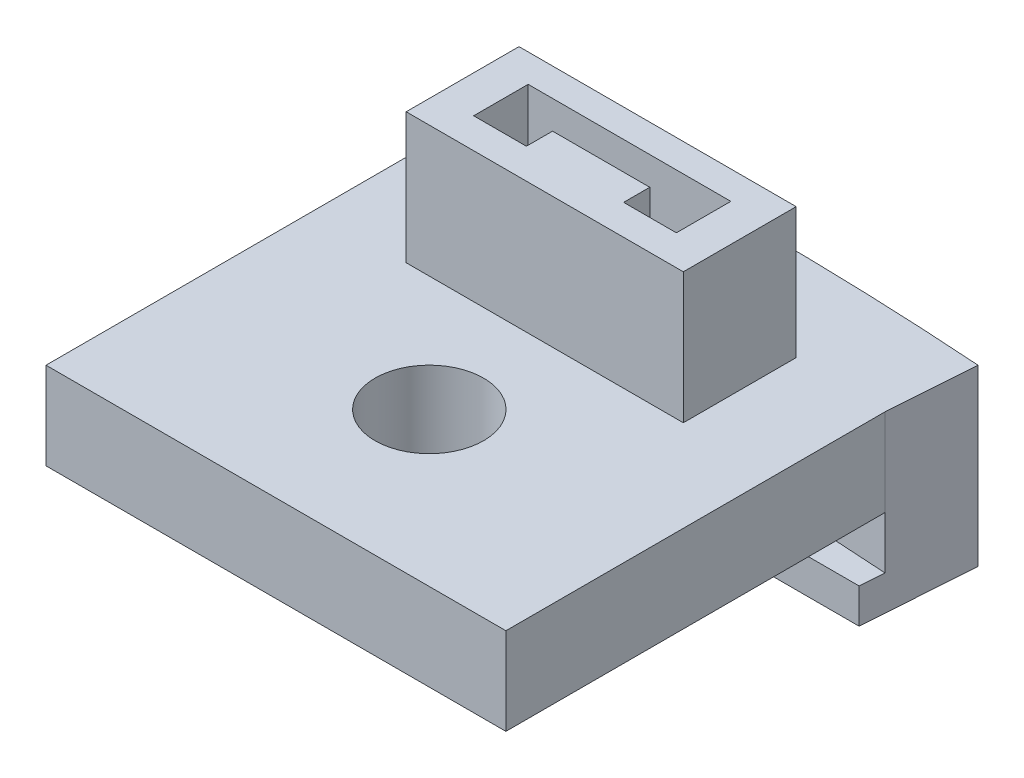
ISO-10303-21;
HEADER;
FILE_DESCRIPTION(('STEP AP214'),'2;1');
FILE_NAME('part.step','',(''),(''),'','','');
FILE_SCHEMA(('AUTOMOTIVE_DESIGN { 1 0 10303 214 1 1 1 1 }'));
ENDSEC;
DATA;
#1=APPLICATION_CONTEXT('core data for automotive mechanical design processes');
#2=APPLICATION_PROTOCOL_DEFINITION('international standard','automotive_design',2000,#1);
#3=PRODUCT_CONTEXT('',#1,'mechanical');
#4=PRODUCT('Part','Part','',(#3));
#5=PRODUCT_RELATED_PRODUCT_CATEGORY('part','',(#4));
#6=PRODUCT_DEFINITION_FORMATION('','',#4);
#7=PRODUCT_DEFINITION_CONTEXT('part definition',#1,'design');
#8=PRODUCT_DEFINITION('design','',#6,#7);
#9=PRODUCT_DEFINITION_SHAPE('','',#8);
#10=(LENGTH_UNIT() NAMED_UNIT(*) SI_UNIT(.MILLI.,.METRE.));
#11=(NAMED_UNIT(*) PLANE_ANGLE_UNIT() SI_UNIT($,.RADIAN.));
#12=(NAMED_UNIT(*) SI_UNIT($,.STERADIAN.) SOLID_ANGLE_UNIT());
#13=UNCERTAINTY_MEASURE_WITH_UNIT(LENGTH_MEASURE(1.E-05),#10,'distance_accuracy_value','');
#14=(GEOMETRIC_REPRESENTATION_CONTEXT(3) GLOBAL_UNCERTAINTY_ASSIGNED_CONTEXT((#13)) GLOBAL_UNIT_ASSIGNED_CONTEXT((#10,
#11,#12)) REPRESENTATION_CONTEXT('',''));
#15=CARTESIAN_POINT('',(0.,0.,0.));
#16=DIRECTION('',(0.,0.,1.));
#17=DIRECTION('',(1.,0.,0.));
#18=AXIS2_PLACEMENT_3D('',#15,#16,#17);
#19=CARTESIAN_POINT('',(0.,0.,0.));
#20=DIRECTION('',(0.,1.,0.));
#21=DIRECTION('',(0.,0.,1.));
#22=AXIS2_PLACEMENT_3D('',#19,#20,#21);
#23=PLANE('',#22);
#24=CARTESIAN_POINT('',(0.,0.,13.62075));
#25=DIRECTION('',(0.,1.,0.));
#26=DIRECTION('',(0.,0.,1.));
#27=AXIS2_PLACEMENT_3D('',#24,#25,#26);
#28=CIRCLE('',#27,5.53085);
#29=CARTESIAN_POINT('',(0.,0.,19.1516));
#30=VERTEX_POINT('',#29);
#31=EDGE_CURVE('E715',#30,#30,#28,.T.);
#32=ORIENTED_EDGE('',*,*,#31,.T.);
#33=EDGE_LOOP('',(#32));
#34=FACE_BOUND('',#33,.T.);
#35=DIRECTION('',(1.,0.,0.));
#36=VECTOR('',#35,1.);
#37=CARTESIAN_POINT('',(0.,0.,1.9558));
#38=LINE('',#37,#36);
#39=CARTESIAN_POINT('',(-5.9055,0.,1.9558));
#40=VERTEX_POINT('',#39);
#41=CARTESIAN_POINT('',(5.9055,0.,1.9558));
#42=VERTEX_POINT('',#41);
#43=EDGE_CURVE('E155',#40,#42,#38,.T.);
#44=ORIENTED_EDGE('',*,*,#43,.F.);
#45=DIRECTION('',(0.,0.,1.));
#46=VECTOR('',#45,1.);
#47=CARTESIAN_POINT('',(-5.9055,0.,0.));
#48=LINE('',#47,#46);
#49=CARTESIAN_POINT('',(-5.9055,0.,5.1308));
#50=VERTEX_POINT('',#49);
#51=EDGE_CURVE('E164',#40,#50,#48,.T.);
#52=ORIENTED_EDGE('',*,*,#51,.T.);
#53=DIRECTION('',(1.,0.,0.));
#54=VECTOR('',#53,1.);
#55=CARTESIAN_POINT('',(0.,0.,5.1308));
#56=LINE('',#55,#54);
#57=CARTESIAN_POINT('',(-2.8321,0.,5.1308));
#58=VERTEX_POINT('',#57);
#59=EDGE_CURVE('E161',#50,#58,#56,.T.);
#60=ORIENTED_EDGE('',*,*,#59,.T.);
#61=DIRECTION('',(0.,0.,1.));
#62=VECTOR('',#61,1.);
#63=CARTESIAN_POINT('',(-2.8321,0.,0.));
#64=LINE('',#63,#62);
#65=CARTESIAN_POINT('',(-2.8321,0.,3.6068));
#66=VERTEX_POINT('',#65);
#67=EDGE_CURVE('E214',#66,#58,#64,.T.);
#68=ORIENTED_EDGE('',*,*,#67,.F.);
#69=DIRECTION('',(1.,0.,0.));
#70=VECTOR('',#69,1.);
#71=CARTESIAN_POINT('',(0.,0.,3.6068));
#72=LINE('',#71,#70);
#73=CARTESIAN_POINT('',(2.8321,0.,3.6068));
#74=VERTEX_POINT('',#73);
#75=EDGE_CURVE('E248',#66,#74,#72,.T.);
#76=ORIENTED_EDGE('',*,*,#75,.T.);
#77=DIRECTION('',(0.,0.,1.));
#78=VECTOR('',#77,1.);
#79=CARTESIAN_POINT('',(2.8321,0.,0.));
#80=LINE('',#79,#78);
#81=CARTESIAN_POINT('',(2.8321,0.,5.1308));
#82=VERTEX_POINT('',#81);
#83=EDGE_CURVE('E208',#74,#82,#80,.T.);
#84=ORIENTED_EDGE('',*,*,#83,.T.);
#85=CARTESIAN_POINT('',(5.9055,0.,5.1308));
#86=VERTEX_POINT('',#85);
#87=EDGE_CURVE('E160',#82,#86,#56,.T.);
#88=ORIENTED_EDGE('',*,*,#87,.T.);
#89=DIRECTION('',(0.,0.,1.));
#90=VECTOR('',#89,1.);
#91=CARTESIAN_POINT('',(5.9055,0.,0.));
#92=LINE('',#91,#90);
#93=EDGE_CURVE('E157',#42,#86,#92,.T.);
#94=ORIENTED_EDGE('',*,*,#93,.F.);
#95=EDGE_LOOP('',(#44,#52,#60,#68,#76,#84,#88,#94));
#96=FACE_BOUND('',#95,.T.);
#97=CARTESIAN_POINT('',(0.,0.,192.0875));
#98=DIRECTION('',(0.,1.,0.));
#99=DIRECTION('',(0.,0.,1.));
#100=AXIS2_PLACEMENT_3D('',#97,#98,#99);
#101=CIRCLE('',#100,192.0875);
#102=CARTESIAN_POINT('',(13.3993466503233,0.,0.467915495715926));
#103=VERTEX_POINT('',#102);
#104=CARTESIAN_POINT('',(-13.3993466503233,0.,0.467915495715926));
#105=VERTEX_POINT('',#104);
#106=EDGE_CURVE('E192',#103,#105,#101,.T.);
#107=ORIENTED_EDGE('',*,*,#106,.F.);
#108=DIRECTION('',(0.,0.,1.));
#109=VECTOR('',#108,1.);
#110=CARTESIAN_POINT('',(13.3993466503233,0.,0.));
#111=LINE('',#110,#109);
#112=CARTESIAN_POINT('',(13.3993466503233,0.,22.5570249983964));
#113=VERTEX_POINT('',#112);
#114=EDGE_CURVE('E146',#103,#113,#111,.T.);
#115=ORIENTED_EDGE('',*,*,#114,.T.);
#116=DIRECTION('',(1.,0.,0.));
#117=VECTOR('',#116,1.);
#118=CARTESIAN_POINT('',(0.,0.,22.5570249983964));
#119=LINE('',#118,#117);
#120=CARTESIAN_POINT('',(-13.3993466503233,0.,22.5570249983964));
#121=VERTEX_POINT('',#120);
#122=EDGE_CURVE('E152',#121,#113,#119,.T.);
#123=ORIENTED_EDGE('',*,*,#122,.F.);
#124=DIRECTION('',(0.,0.,1.));
#125=VECTOR('',#124,1.);
#126=CARTESIAN_POINT('',(-13.3993466503233,0.,0.));
#127=LINE('',#126,#125);
#128=EDGE_CURVE('E149',#105,#121,#127,.T.);
#129=ORIENTED_EDGE('',*,*,#128,.F.);
#130=EDGE_LOOP('',(#107,#115,#123,#129));
#131=FACE_BOUND('',#130,.T.);
#132=ADVANCED_FACE('F34',(#34,#96,#131),#23,.F.);
#133=CARTESIAN_POINT('',(0.,5.08,5.1308));
#134=DIRECTION('',(0.,0.,-1.));
#135=DIRECTION('',(-1.,0.,0.));
#136=AXIS2_PLACEMENT_3D('',#133,#134,#135);
#137=PLANE('',#136);
#138=DIRECTION('',(0.,-1.,0.));
#139=VECTOR('',#138,1.);
#140=CARTESIAN_POINT('',(-5.9055,5.08,5.1308));
#141=LINE('',#140,#139);
#142=CARTESIAN_POINT('',(-5.9055,12.7,5.1308));
#143=VERTEX_POINT('',#142);
#144=EDGE_CURVE('E169',#143,#50,#141,.T.);
#145=ORIENTED_EDGE('',*,*,#144,.F.);
#146=DIRECTION('',(1.,0.,0.));
#147=VECTOR('',#146,1.);
#148=CARTESIAN_POINT('',(0.,12.7,5.1308));
#149=LINE('',#148,#147);
#150=CARTESIAN_POINT('',(-2.8321,12.7,5.1308));
#151=VERTEX_POINT('',#150);
#152=EDGE_CURVE('E233',#143,#151,#149,.T.);
#153=ORIENTED_EDGE('',*,*,#152,.T.);
#154=DIRECTION('',(0.,-1.,0.));
#155=VECTOR('',#154,1.);
#156=CARTESIAN_POINT('',(-2.8321,12.7,5.1308));
#157=LINE('',#156,#155);
#158=EDGE_CURVE('E253',#151,#58,#157,.T.);
#159=ORIENTED_EDGE('',*,*,#158,.T.);
#160=ORIENTED_EDGE('',*,*,#59,.F.);
#161=EDGE_LOOP('',(#145,#153,#159,#160));
#162=FACE_BOUND('',#161,.T.);
#163=ADVANCED_FACE('F374',(#162),#137,.T.);
#164=CARTESIAN_POINT('',(0.,5.08,1.9558));
#165=DIRECTION('',(0.,0.,-1.));
#166=DIRECTION('',(-1.,0.,0.));
#167=AXIS2_PLACEMENT_3D('',#164,#165,#166);
#168=PLANE('',#167);
#169=ORIENTED_EDGE('',*,*,#43,.T.);
#170=DIRECTION('',(0.,-1.,0.));
#171=VECTOR('',#170,1.);
#172=CARTESIAN_POINT('',(5.9055,5.08,1.9558));
#173=LINE('',#172,#171);
#174=CARTESIAN_POINT('',(5.9055,12.7,1.9558));
#175=VERTEX_POINT('',#174);
#176=EDGE_CURVE('E42',#175,#42,#173,.T.);
#177=ORIENTED_EDGE('',*,*,#176,.F.);
#178=DIRECTION('',(1.,0.,0.));
#179=VECTOR('',#178,1.);
#180=CARTESIAN_POINT('',(0.,12.7,1.9558));
#181=LINE('',#180,#179);
#182=CARTESIAN_POINT('',(-5.9055,12.7,1.9558));
#183=VERTEX_POINT('',#182);
#184=EDGE_CURVE('E223',#183,#175,#181,.T.);
#185=ORIENTED_EDGE('',*,*,#184,.F.);
#186=DIRECTION('',(0.,-1.,0.));
#187=VECTOR('',#186,1.);
#188=CARTESIAN_POINT('',(-5.9055,5.08,1.9558));
#189=LINE('',#188,#187);
#190=EDGE_CURVE('E89',#183,#40,#189,.T.);
#191=ORIENTED_EDGE('',*,*,#190,.T.);
#192=EDGE_LOOP('',(#169,#177,#185,#191));
#193=FACE_BOUND('',#192,.T.);
#194=ADVANCED_FACE('F380',(#193),#168,.F.);
#195=CARTESIAN_POINT('',(5.9055,5.08,0.));
#196=DIRECTION('',(1.,0.,0.));
#197=DIRECTION('',(0.,0.,-1.));
#198=AXIS2_PLACEMENT_3D('',#195,#196,#197);
#199=PLANE('',#198);
#200=ORIENTED_EDGE('',*,*,#93,.T.);
#201=DIRECTION('',(0.,-1.,0.));
#202=VECTOR('',#201,1.);
#203=CARTESIAN_POINT('',(5.9055,5.08,5.1308));
#204=LINE('',#203,#202);
#205=CARTESIAN_POINT('',(5.9055,12.7,5.1308));
#206=VERTEX_POINT('',#205);
#207=EDGE_CURVE('E171',#206,#86,#204,.T.);
#208=ORIENTED_EDGE('',*,*,#207,.F.);
#209=DIRECTION('',(0.,0.,1.));
#210=VECTOR('',#209,1.);
#211=CARTESIAN_POINT('',(5.9055,12.7,0.));
#212=LINE('',#211,#210);
#213=EDGE_CURVE('E226',#175,#206,#212,.T.);
#214=ORIENTED_EDGE('',*,*,#213,.F.);
#215=ORIENTED_EDGE('',*,*,#176,.T.);
#216=EDGE_LOOP('',(#200,#208,#214,#215));
#217=FACE_BOUND('',#216,.T.);
#218=ADVANCED_FACE('F399',(#217),#199,.F.);
#219=ORIENTED_EDGE('',*,*,#87,.F.);
#220=DIRECTION('',(0.,-1.,0.));
#221=VECTOR('',#220,1.);
#222=CARTESIAN_POINT('',(2.8321,12.7,5.1308));
#223=LINE('',#222,#221);
#224=CARTESIAN_POINT('',(2.8321,12.7,5.1308));
#225=VERTEX_POINT('',#224);
#226=EDGE_CURVE('E263',#225,#82,#223,.T.);
#227=ORIENTED_EDGE('',*,*,#226,.F.);
#228=EDGE_CURVE('E229',#225,#206,#149,.T.);
#229=ORIENTED_EDGE('',*,*,#228,.T.);
#230=ORIENTED_EDGE('',*,*,#207,.T.);
#231=EDGE_LOOP('',(#219,#227,#229,#230));
#232=FACE_BOUND('',#231,.T.);
#233=ADVANCED_FACE('F383',(#232),#137,.T.);
#234=CARTESIAN_POINT('',(13.3993466503233,5.08,0.));
#235=DIRECTION('',(1.,0.,0.));
#236=DIRECTION('',(0.,0.,-1.));
#237=AXIS2_PLACEMENT_3D('',#234,#235,#236);
#238=PLANE('',#237);
#239=ORIENTED_EDGE('',*,*,#114,.F.);
#240=DIRECTION('',(0.,-1.,0.));
#241=VECTOR('',#240,1.);
#242=CARTESIAN_POINT('',(13.3993466503233,5.08,0.467915495715926));
#243=LINE('',#242,#241);
#244=CARTESIAN_POINT('',(13.3993466503233,5.08,0.467915495715926));
#245=VERTEX_POINT('',#244);
#246=EDGE_CURVE('E98',#245,#103,#243,.T.);
#247=ORIENTED_EDGE('',*,*,#246,.F.);
#248=DIRECTION('',(0.,0.,1.));
#249=VECTOR('',#248,1.);
#250=CARTESIAN_POINT('',(13.3993466503233,5.08,0.));
#251=LINE('',#250,#249);
#252=CARTESIAN_POINT('',(13.3993466503233,5.08,22.5570249983964));
#253=VERTEX_POINT('',#252);
#254=EDGE_CURVE('E167',#245,#253,#251,.T.);
#255=ORIENTED_EDGE('',*,*,#254,.T.);
#256=DIRECTION('',(0.,-1.,0.));
#257=VECTOR('',#256,1.);
#258=CARTESIAN_POINT('',(13.3993466503233,5.08,22.5570249983964));
#259=LINE('',#258,#257);
#260=EDGE_CURVE('E145',#253,#113,#259,.T.);
#261=ORIENTED_EDGE('',*,*,#260,.T.);
#262=EDGE_LOOP('',(#239,#247,#255,#261));
#263=FACE_BOUND('',#262,.T.);
#264=ADVANCED_FACE('F36',(#263),#238,.T.);
#265=CARTESIAN_POINT('',(13.3667065153319,5.08,0.934691172801612));
#266=DIRECTION('',(0.997564050259825,0.,0.0697564737441179));
#267=DIRECTION('',(0.0697564737441179,0.,-0.997564050259825));
#268=AXIS2_PLACEMENT_3D('',#265,#266,#267);
#269=PLANE('',#268);
#270=DIRECTION('',(0.,1.,0.));
#271=VECTOR('',#270,1.);
#272=CARTESIAN_POINT('',(13.3993466503233,-5.08,0.467915495715926));
#273=LINE('',#272,#271);
#274=CARTESIAN_POINT('',(13.3993466503233,-3.048,0.467915495715926));
#275=VERTEX_POINT('',#274);
#276=EDGE_CURVE('E187',#275,#103,#273,.T.);
#277=ORIENTED_EDGE('',*,*,#276,.F.);
#278=DIRECTION('',(-0.0697564737441179,0.,0.997564050259825));
#279=VECTOR('',#278,1.);
#280=CARTESIAN_POINT('',(13.7535788992914,-3.048,-4.59784167414245));
#281=LINE('',#280,#279);
#282=CARTESIAN_POINT('',(13.3006711291802,-3.048,1.87904119129026));
#283=VERTEX_POINT('',#282);
#284=EDGE_CURVE('E713',#275,#283,#281,.T.);
#285=ORIENTED_EDGE('',*,*,#284,.T.);
#286=DIRECTION('',(0.,-1.,0.));
#287=VECTOR('',#286,1.);
#288=CARTESIAN_POINT('',(13.3006711291802,-3.048,1.87904119129026));
#289=LINE('',#288,#287);
#290=CARTESIAN_POINT('',(13.3006711291802,-5.08,1.87904119129026));
#291=VERTEX_POINT('',#290);
#292=EDGE_CURVE('E201',#283,#291,#289,.T.);
#293=ORIENTED_EDGE('',*,*,#292,.T.);
#294=DIRECTION('',(-0.0697564737441179,0.,0.997564050259825));
#295=VECTOR('',#294,1.);
#296=CARTESIAN_POINT('',(13.3667065153319,-5.08,0.934691172801612));
#297=LINE('',#296,#295);
#298=CARTESIAN_POINT('',(13.7535788992914,-5.08,-4.59784167414245));
#299=VERTEX_POINT('',#298);
#300=EDGE_CURVE('E205',#299,#291,#297,.T.);
#301=ORIENTED_EDGE('',*,*,#300,.F.);
#302=DIRECTION('',(0.,-1.,0.));
#303=VECTOR('',#302,1.);
#304=CARTESIAN_POINT('',(13.7535788992914,5.08,-4.59784167414245));
#305=LINE('',#304,#303);
#306=CARTESIAN_POINT('',(13.7535788992914,5.08,-4.59784167414245));
#307=VERTEX_POINT('',#306);
#308=EDGE_CURVE('E179',#307,#299,#305,.T.);
#309=ORIENTED_EDGE('',*,*,#308,.F.);
#310=DIRECTION('',(-0.0697564737441179,0.,0.997564050259825));
#311=VECTOR('',#310,1.);
#312=CARTESIAN_POINT('',(13.3667065153319,5.08,0.934691172801612));
#313=LINE('',#312,#311);
#314=EDGE_CURVE('E188',#307,#245,#313,.T.);
#315=ORIENTED_EDGE('',*,*,#314,.T.);
#316=ORIENTED_EDGE('',*,*,#246,.T.);
#317=EDGE_LOOP('',(#277,#285,#293,#301,#309,#315,#316));
#318=FACE_BOUND('',#317,.T.);
#319=ADVANCED_FACE('F184',(#318),#269,.T.);
#320=CARTESIAN_POINT('',(0.,5.08,192.0875));
#321=DIRECTION('',(0.,-1.,0.));
#322=DIRECTION('',(0.,0.,-1.));
#323=AXIS2_PLACEMENT_3D('',#320,#321,#322);
#324=CYLINDRICAL_SURFACE('',#323,197.165627232571);
#325=ORIENTED_EDGE('',*,*,#308,.T.);
#326=CARTESIAN_POINT('',(0.,-5.08,192.0875));
#327=DIRECTION('',(0.,1.,0.));
#328=DIRECTION('',(0.,0.,1.));
#329=AXIS2_PLACEMENT_3D('',#326,#327,#328);
#330=CIRCLE('',#329,197.165627232571);
#331=CARTESIAN_POINT('',(-13.7535788992915,-5.08,-4.59784167414245));
#332=VERTEX_POINT('',#331);
#333=EDGE_CURVE('E194',#332,#299,#330,.F.);
#334=ORIENTED_EDGE('',*,*,#333,.F.);
#335=DIRECTION('',(0.,-1.,0.));
#336=VECTOR('',#335,1.);
#337=CARTESIAN_POINT('',(-13.7535788992915,5.08,-4.59784167414245));
#338=LINE('',#337,#336);
#339=CARTESIAN_POINT('',(-13.7535788992915,5.08,-4.59784167414245));
#340=VERTEX_POINT('',#339);
#341=EDGE_CURVE('E133',#340,#332,#338,.T.);
#342=ORIENTED_EDGE('',*,*,#341,.F.);
#343=CARTESIAN_POINT('',(0.,5.08,192.0875));
#344=DIRECTION('',(0.,1.,0.));
#345=DIRECTION('',(0.,0.,1.));
#346=AXIS2_PLACEMENT_3D('',#343,#344,#345);
#347=CIRCLE('',#346,197.165627232571);
#348=EDGE_CURVE('E118',#340,#307,#347,.F.);
#349=ORIENTED_EDGE('',*,*,#348,.T.);
#350=EDGE_LOOP('',(#325,#334,#342,#349));
#351=FACE_BOUND('',#350,.T.);
#352=ADVANCED_FACE('F287',(#351),#324,.T.);
#353=CARTESIAN_POINT('',(-13.366706515332,5.08,0.934691172801615));
#354=DIRECTION('',(0.997564050259825,0.,-0.0697564737441179));
#355=DIRECTION('',(-0.0697564737441179,0.,-0.997564050259825));
#356=AXIS2_PLACEMENT_3D('',#353,#354,#355);
#357=PLANE('',#356);
#358=ORIENTED_EDGE('',*,*,#341,.T.);
#359=DIRECTION('',(0.0697564737441179,0.,0.997564050259825));
#360=VECTOR('',#359,1.);
#361=CARTESIAN_POINT('',(-13.366706515332,-5.08,0.934691172801615));
#362=LINE('',#361,#360);
#363=CARTESIAN_POINT('',(-13.3006711291803,-5.08,1.87904119129026));
#364=VERTEX_POINT('',#363);
#365=EDGE_CURVE('E198',#332,#364,#362,.T.);
#366=ORIENTED_EDGE('',*,*,#365,.T.);
#367=DIRECTION('',(0.,-1.,0.));
#368=VECTOR('',#367,1.);
#369=CARTESIAN_POINT('',(-13.3006711291803,-3.048,1.87904119129026));
#370=LINE('',#369,#368);
#371=CARTESIAN_POINT('',(-13.3006711291803,-3.048,1.87904119129026));
#372=VERTEX_POINT('',#371);
#373=EDGE_CURVE('E195',#372,#364,#370,.T.);
#374=ORIENTED_EDGE('',*,*,#373,.F.);
#375=DIRECTION('',(-0.0697564737441189,0.,-0.997564050259825));
#376=VECTOR('',#375,1.);
#377=CARTESIAN_POINT('',(-13.3993466503233,-3.048,0.467915495715926));
#378=LINE('',#377,#376);
#379=CARTESIAN_POINT('',(-13.3993466503233,-3.048,0.467915495715926));
#380=VERTEX_POINT('',#379);
#381=EDGE_CURVE('E723',#372,#380,#378,.T.);
#382=ORIENTED_EDGE('',*,*,#381,.T.);
#383=DIRECTION('',(0.,1.,0.));
#384=VECTOR('',#383,1.);
#385=CARTESIAN_POINT('',(-13.3993466503233,-5.08,0.467915495715926));
#386=LINE('',#385,#384);
#387=EDGE_CURVE('E129',#380,#105,#386,.T.);
#388=ORIENTED_EDGE('',*,*,#387,.T.);
#389=DIRECTION('',(0.,-1.,0.));
#390=VECTOR('',#389,1.);
#391=CARTESIAN_POINT('',(-13.3993466503233,5.08,0.467915495715926));
#392=LINE('',#391,#390);
#393=CARTESIAN_POINT('',(-13.3993466503233,5.08,0.467915495715926));
#394=VERTEX_POINT('',#393);
#395=EDGE_CURVE('E124',#394,#105,#392,.T.);
#396=ORIENTED_EDGE('',*,*,#395,.F.);
#397=DIRECTION('',(0.0697564737441179,0.,0.997564050259825));
#398=VECTOR('',#397,1.);
#399=CARTESIAN_POINT('',(-13.366706515332,5.08,0.934691172801615));
#400=LINE('',#399,#398);
#401=EDGE_CURVE('E109',#340,#394,#400,.T.);
#402=ORIENTED_EDGE('',*,*,#401,.F.);
#403=EDGE_LOOP('',(#358,#366,#374,#382,#388,#396,#402));
#404=FACE_BOUND('',#403,.T.);
#405=ADVANCED_FACE('F125',(#404),#357,.F.);
#406=CARTESIAN_POINT('',(-13.3993466503233,5.08,0.));
#407=DIRECTION('',(1.,0.,0.));
#408=DIRECTION('',(0.,0.,-1.));
#409=AXIS2_PLACEMENT_3D('',#406,#407,#408);
#410=PLANE('',#409);
#411=ORIENTED_EDGE('',*,*,#128,.T.);
#412=DIRECTION('',(0.,-1.,0.));
#413=VECTOR('',#412,1.);
#414=CARTESIAN_POINT('',(-13.3993466503233,5.08,22.5570249983964));
#415=LINE('',#414,#413);
#416=CARTESIAN_POINT('',(-13.3993466503233,5.08,22.5570249983964));
#417=VERTEX_POINT('',#416);
#418=EDGE_CURVE('E134',#417,#121,#415,.T.);
#419=ORIENTED_EDGE('',*,*,#418,.F.);
#420=DIRECTION('',(0.,0.,1.));
#421=VECTOR('',#420,1.);
#422=CARTESIAN_POINT('',(-13.3993466503233,5.08,0.));
#423=LINE('',#422,#421);
#424=EDGE_CURVE('E114',#394,#417,#423,.T.);
#425=ORIENTED_EDGE('',*,*,#424,.F.);
#426=ORIENTED_EDGE('',*,*,#395,.T.);
#427=EDGE_LOOP('',(#411,#419,#425,#426));
#428=FACE_BOUND('',#427,.T.);
#429=ADVANCED_FACE('F136',(#428),#410,.F.);
#430=CARTESIAN_POINT('',(-5.9055,5.08,0.));
#431=DIRECTION('',(1.,0.,0.));
#432=DIRECTION('',(0.,0.,-1.));
#433=AXIS2_PLACEMENT_3D('',#430,#431,#432);
#434=PLANE('',#433);
#435=ORIENTED_EDGE('',*,*,#51,.F.);
#436=ORIENTED_EDGE('',*,*,#190,.F.);
#437=DIRECTION('',(0.,0.,1.));
#438=VECTOR('',#437,1.);
#439=CARTESIAN_POINT('',(-5.9055,12.7,0.));
#440=LINE('',#439,#438);
#441=EDGE_CURVE('E242',#183,#143,#440,.T.);
#442=ORIENTED_EDGE('',*,*,#441,.T.);
#443=ORIENTED_EDGE('',*,*,#144,.T.);
#444=EDGE_LOOP('',(#435,#436,#442,#443));
#445=FACE_BOUND('',#444,.T.);
#446=ADVANCED_FACE('F394',(#445),#434,.T.);
#447=CARTESIAN_POINT('',(0.,5.08,22.5570249983964));
#448=DIRECTION('',(0.,0.,-1.));
#449=DIRECTION('',(-1.,0.,0.));
#450=AXIS2_PLACEMENT_3D('',#447,#448,#449);
#451=PLANE('',#450);
#452=ORIENTED_EDGE('',*,*,#122,.T.);
#453=ORIENTED_EDGE('',*,*,#260,.F.);
#454=DIRECTION('',(1.,0.,0.));
#455=VECTOR('',#454,1.);
#456=CARTESIAN_POINT('',(0.,5.08,22.5570249983964));
#457=LINE('',#456,#455);
#458=EDGE_CURVE('E58',#417,#253,#457,.T.);
#459=ORIENTED_EDGE('',*,*,#458,.F.);
#460=ORIENTED_EDGE('',*,*,#418,.T.);
#461=EDGE_LOOP('',(#452,#453,#459,#460));
#462=FACE_BOUND('',#461,.T.);
#463=ADVANCED_FACE('F392',(#462),#451,.F.);
#464=CARTESIAN_POINT('',(0.,5.08,13.62075));
#465=DIRECTION('',(0.,-1.,0.));
#466=DIRECTION('',(0.,0.,-1.));
#467=AXIS2_PLACEMENT_3D('',#464,#465,#466);
#468=CYLINDRICAL_SURFACE('',#467,3.1623);
#469=CARTESIAN_POINT('',(0.,5.08,13.62075));
#470=DIRECTION('',(0.,1.,0.));
#471=DIRECTION('',(0.,0.,1.));
#472=AXIS2_PLACEMENT_3D('',#469,#470,#471);
#473=CIRCLE('',#472,3.1623);
#474=CARTESIAN_POINT('',(0.,5.08,16.78305));
#475=VERTEX_POINT('',#474);
#476=EDGE_CURVE('E139',#475,#475,#473,.T.);
#477=ORIENTED_EDGE('',*,*,#476,.T.);
#478=EDGE_LOOP('',(#477));
#479=FACE_BOUND('',#478,.T.);
#480=CARTESIAN_POINT('',(0.,-1.27,13.62075));
#481=DIRECTION('',(0.,1.,0.));
#482=DIRECTION('',(0.,0.,1.));
#483=AXIS2_PLACEMENT_3D('',#480,#481,#482);
#484=CIRCLE('',#483,3.1623);
#485=CARTESIAN_POINT('',(0.,-1.27,16.78305));
#486=VERTEX_POINT('',#485);
#487=EDGE_CURVE('E706',#486,#486,#484,.T.);
#488=ORIENTED_EDGE('',*,*,#487,.F.);
#489=EDGE_LOOP('',(#488));
#490=FACE_BOUND('',#489,.T.);
#491=ADVANCED_FACE('F389',(#479,#490),#468,.F.);
#492=CARTESIAN_POINT('',(0.,5.08,0.));
#493=DIRECTION('',(0.,1.,0.));
#494=DIRECTION('',(0.,0.,1.));
#495=AXIS2_PLACEMENT_3D('',#492,#493,#494);
#496=PLANE('',#495);
#497=DIRECTION('',(0.,0.,-1.));
#498=VECTOR('',#497,1.);
#499=CARTESIAN_POINT('',(8.07507128334694,5.08,0.));
#500=LINE('',#499,#498);
#501=CARTESIAN_POINT('',(8.07507128334694,5.08,6.89416892167906));
#502=VERTEX_POINT('',#501);
#503=CARTESIAN_POINT('',(8.07507128334694,5.08,0.319431078320941));
#504=VERTEX_POINT('',#503);
#505=EDGE_CURVE('E150',#502,#504,#500,.T.);
#506=ORIENTED_EDGE('',*,*,#505,.F.);
#507=DIRECTION('',(-1.,0.,0.));
#508=VECTOR('',#507,1.);
#509=CARTESIAN_POINT('',(0.,5.08,6.89416892167906));
#510=LINE('',#509,#508);
#511=CARTESIAN_POINT('',(-8.07507128334694,5.08,6.89416892167906));
#512=VERTEX_POINT('',#511);
#513=EDGE_CURVE('E266',#502,#512,#510,.T.);
#514=ORIENTED_EDGE('',*,*,#513,.T.);
#515=DIRECTION('',(0.,0.,-1.));
#516=VECTOR('',#515,1.);
#517=CARTESIAN_POINT('',(-8.07507128334694,5.08,0.));
#518=LINE('',#517,#516);
#519=CARTESIAN_POINT('',(-8.07507128334694,5.08,0.319431078320941));
#520=VERTEX_POINT('',#519);
#521=EDGE_CURVE('E277',#512,#520,#518,.T.);
#522=ORIENTED_EDGE('',*,*,#521,.T.);
#523=DIRECTION('',(-1.,0.,0.));
#524=VECTOR('',#523,1.);
#525=CARTESIAN_POINT('',(0.,5.08,0.319431078320941));
#526=LINE('',#525,#524);
#527=EDGE_CURVE('E280',#504,#520,#526,.T.);
#528=ORIENTED_EDGE('',*,*,#527,.F.);
#529=EDGE_LOOP('',(#506,#514,#522,#528));
#530=FACE_BOUND('',#529,.T.);
#531=ORIENTED_EDGE('',*,*,#254,.F.);
#532=ORIENTED_EDGE('',*,*,#314,.F.);
#533=ORIENTED_EDGE('',*,*,#348,.F.);
#534=ORIENTED_EDGE('',*,*,#401,.T.);
#535=ORIENTED_EDGE('',*,*,#424,.T.);
#536=ORIENTED_EDGE('',*,*,#458,.T.);
#537=EDGE_LOOP('',(#531,#532,#533,#534,#535,#536));
#538=FACE_BOUND('',#537,.T.);
#539=ORIENTED_EDGE('',*,*,#476,.F.);
#540=EDGE_LOOP('',(#539));
#541=FACE_BOUND('',#540,.T.);
#542=ADVANCED_FACE('F111',(#530,#538,#541),#496,.T.);
#543=CARTESIAN_POINT('',(2.8321,12.7,0.));
#544=DIRECTION('',(1.,0.,0.));
#545=DIRECTION('',(0.,0.,-1.));
#546=AXIS2_PLACEMENT_3D('',#543,#544,#545);
#547=PLANE('',#546);
#548=ORIENTED_EDGE('',*,*,#83,.F.);
#549=DIRECTION('',(0.,-1.,0.));
#550=VECTOR('',#549,1.);
#551=CARTESIAN_POINT('',(2.8321,12.7,3.6068));
#552=LINE('',#551,#550);
#553=CARTESIAN_POINT('',(2.8321,12.7,3.6068));
#554=VERTEX_POINT('',#553);
#555=EDGE_CURVE('E260',#554,#74,#552,.T.);
#556=ORIENTED_EDGE('',*,*,#555,.F.);
#557=DIRECTION('',(0.,0.,1.));
#558=VECTOR('',#557,1.);
#559=CARTESIAN_POINT('',(2.8321,12.7,0.));
#560=LINE('',#559,#558);
#561=EDGE_CURVE('E232',#554,#225,#560,.T.);
#562=ORIENTED_EDGE('',*,*,#561,.T.);
#563=ORIENTED_EDGE('',*,*,#226,.T.);
#564=EDGE_LOOP('',(#548,#556,#562,#563));
#565=FACE_BOUND('',#564,.T.);
#566=ADVANCED_FACE('F471',(#565),#547,.T.);
#567=CARTESIAN_POINT('',(0.,12.7,3.6068));
#568=DIRECTION('',(0.,0.,-1.));
#569=DIRECTION('',(-1.,0.,0.));
#570=AXIS2_PLACEMENT_3D('',#567,#568,#569);
#571=PLANE('',#570);
#572=ORIENTED_EDGE('',*,*,#75,.F.);
#573=DIRECTION('',(0.,-1.,0.));
#574=VECTOR('',#573,1.);
#575=CARTESIAN_POINT('',(-2.8321,12.7,3.6068));
#576=LINE('',#575,#574);
#577=CARTESIAN_POINT('',(-2.8321,12.7,3.6068));
#578=VERTEX_POINT('',#577);
#579=EDGE_CURVE('E256',#578,#66,#576,.T.);
#580=ORIENTED_EDGE('',*,*,#579,.F.);
#581=DIRECTION('',(1.,0.,0.));
#582=VECTOR('',#581,1.);
#583=CARTESIAN_POINT('',(0.,12.7,3.6068));
#584=LINE('',#583,#582);
#585=EDGE_CURVE('E236',#578,#554,#584,.T.);
#586=ORIENTED_EDGE('',*,*,#585,.T.);
#587=ORIENTED_EDGE('',*,*,#555,.T.);
#588=EDGE_LOOP('',(#572,#580,#586,#587));
#589=FACE_BOUND('',#588,.T.);
#590=ADVANCED_FACE('F480',(#589),#571,.T.);
#591=CARTESIAN_POINT('',(-2.8321,12.7,0.));
#592=DIRECTION('',(1.,0.,0.));
#593=DIRECTION('',(0.,0.,-1.));
#594=AXIS2_PLACEMENT_3D('',#591,#592,#593);
#595=PLANE('',#594);
#596=ORIENTED_EDGE('',*,*,#67,.T.);
#597=ORIENTED_EDGE('',*,*,#158,.F.);
#598=DIRECTION('',(0.,0.,1.));
#599=VECTOR('',#598,1.);
#600=CARTESIAN_POINT('',(-2.8321,12.7,0.));
#601=LINE('',#600,#599);
#602=EDGE_CURVE('E239',#578,#151,#601,.T.);
#603=ORIENTED_EDGE('',*,*,#602,.F.);
#604=ORIENTED_EDGE('',*,*,#579,.T.);
#605=EDGE_LOOP('',(#596,#597,#603,#604));
#606=FACE_BOUND('',#605,.T.);
#607=ADVANCED_FACE('F490',(#606),#595,.F.);
#608=CARTESIAN_POINT('',(8.07507128334694,12.7,0.));
#609=DIRECTION('',(1.,0.,0.));
#610=DIRECTION('',(0.,0.,-1.));
#611=AXIS2_PLACEMENT_3D('',#608,#609,#610);
#612=PLANE('',#611);
#613=DIRECTION('',(0.,-1.,0.));
#614=VECTOR('',#613,1.);
#615=CARTESIAN_POINT('',(8.07507128334694,12.7,6.89416892167906));
#616=LINE('',#615,#614);
#617=CARTESIAN_POINT('',(8.07507128334694,12.7,6.89416892167906));
#618=VERTEX_POINT('',#617);
#619=EDGE_CURVE('E245',#618,#502,#616,.T.);
#620=ORIENTED_EDGE('',*,*,#619,.T.);
#621=ORIENTED_EDGE('',*,*,#505,.T.);
#622=DIRECTION('',(0.,-1.,0.));
#623=VECTOR('',#622,1.);
#624=CARTESIAN_POINT('',(8.07507128334694,12.7,0.319431078320941));
#625=LINE('',#624,#623);
#626=CARTESIAN_POINT('',(8.07507128334694,12.7,0.319431078320941));
#627=VERTEX_POINT('',#626);
#628=EDGE_CURVE('E257',#627,#504,#625,.T.);
#629=ORIENTED_EDGE('',*,*,#628,.F.);
#630=DIRECTION('',(0.,0.,1.));
#631=VECTOR('',#630,1.);
#632=CARTESIAN_POINT('',(8.07507128334694,12.7,0.));
#633=LINE('',#632,#631);
#634=EDGE_CURVE('E210',#627,#618,#633,.T.);
#635=ORIENTED_EDGE('',*,*,#634,.T.);
#636=EDGE_LOOP('',(#620,#621,#629,#635));
#637=FACE_BOUND('',#636,.T.);
#638=ADVANCED_FACE('F350',(#637),#612,.T.);
#639=CARTESIAN_POINT('',(0.,12.7,0.319431078320941));
#640=DIRECTION('',(0.,0.,-1.));
#641=DIRECTION('',(-1.,0.,0.));
#642=AXIS2_PLACEMENT_3D('',#639,#640,#641);
#643=PLANE('',#642);
#644=ORIENTED_EDGE('',*,*,#628,.T.);
#645=ORIENTED_EDGE('',*,*,#527,.T.);
#646=DIRECTION('',(0.,-1.,0.));
#647=VECTOR('',#646,1.);
#648=CARTESIAN_POINT('',(-8.07507128334694,12.7,0.319431078320941));
#649=LINE('',#648,#647);
#650=CARTESIAN_POINT('',(-8.07507128334694,12.7,0.319431078320941));
#651=VERTEX_POINT('',#650);
#652=EDGE_CURVE('E270',#651,#520,#649,.T.);
#653=ORIENTED_EDGE('',*,*,#652,.F.);
#654=DIRECTION('',(1.,0.,0.));
#655=VECTOR('',#654,1.);
#656=CARTESIAN_POINT('',(0.,12.7,0.319431078320941));
#657=LINE('',#656,#655);
#658=EDGE_CURVE('E213',#651,#627,#657,.T.);
#659=ORIENTED_EDGE('',*,*,#658,.T.);
#660=EDGE_LOOP('',(#644,#645,#653,#659));
#661=FACE_BOUND('',#660,.T.);
#662=ADVANCED_FACE('F354',(#661),#643,.T.);
#663=CARTESIAN_POINT('',(-8.07507128334694,12.7,0.));
#664=DIRECTION('',(1.,0.,0.));
#665=DIRECTION('',(0.,0.,-1.));
#666=AXIS2_PLACEMENT_3D('',#663,#664,#665);
#667=PLANE('',#666);
#668=ORIENTED_EDGE('',*,*,#521,.F.);
#669=DIRECTION('',(0.,-1.,0.));
#670=VECTOR('',#669,1.);
#671=CARTESIAN_POINT('',(-8.07507128334694,12.7,6.89416892167906));
#672=LINE('',#671,#670);
#673=CARTESIAN_POINT('',(-8.07507128334694,12.7,6.89416892167906));
#674=VERTEX_POINT('',#673);
#675=EDGE_CURVE('E49',#674,#512,#672,.T.);
#676=ORIENTED_EDGE('',*,*,#675,.F.);
#677=DIRECTION('',(0.,0.,1.));
#678=VECTOR('',#677,1.);
#679=CARTESIAN_POINT('',(-8.07507128334694,12.7,0.));
#680=LINE('',#679,#678);
#681=EDGE_CURVE('E217',#651,#674,#680,.T.);
#682=ORIENTED_EDGE('',*,*,#681,.F.);
#683=ORIENTED_EDGE('',*,*,#652,.T.);
#684=EDGE_LOOP('',(#668,#676,#682,#683));
#685=FACE_BOUND('',#684,.T.);
#686=ADVANCED_FACE('F357',(#685),#667,.F.);
#687=CARTESIAN_POINT('',(0.,12.7,6.89416892167906));
#688=DIRECTION('',(0.,0.,-1.));
#689=DIRECTION('',(-1.,0.,0.));
#690=AXIS2_PLACEMENT_3D('',#687,#688,#689);
#691=PLANE('',#690);
#692=ORIENTED_EDGE('',*,*,#513,.F.);
#693=ORIENTED_EDGE('',*,*,#619,.F.);
#694=DIRECTION('',(1.,0.,0.));
#695=VECTOR('',#694,1.);
#696=CARTESIAN_POINT('',(0.,12.7,6.89416892167906));
#697=LINE('',#696,#695);
#698=EDGE_CURVE('E220',#674,#618,#697,.T.);
#699=ORIENTED_EDGE('',*,*,#698,.F.);
#700=ORIENTED_EDGE('',*,*,#675,.T.);
#701=EDGE_LOOP('',(#692,#693,#699,#700));
#702=FACE_BOUND('',#701,.T.);
#703=ADVANCED_FACE('F362',(#702),#691,.F.);
#704=CARTESIAN_POINT('',(0.,12.7,0.));
#705=DIRECTION('',(0.,1.,0.));
#706=DIRECTION('',(0.,0.,1.));
#707=AXIS2_PLACEMENT_3D('',#704,#705,#706);
#708=PLANE('',#707);
#709=ORIENTED_EDGE('',*,*,#634,.F.);
#710=ORIENTED_EDGE('',*,*,#658,.F.);
#711=ORIENTED_EDGE('',*,*,#681,.T.);
#712=ORIENTED_EDGE('',*,*,#698,.T.);
#713=EDGE_LOOP('',(#709,#710,#711,#712));
#714=FACE_BOUND('',#713,.T.);
#715=ORIENTED_EDGE('',*,*,#184,.T.);
#716=ORIENTED_EDGE('',*,*,#213,.T.);
#717=ORIENTED_EDGE('',*,*,#228,.F.);
#718=ORIENTED_EDGE('',*,*,#561,.F.);
#719=ORIENTED_EDGE('',*,*,#585,.F.);
#720=ORIENTED_EDGE('',*,*,#602,.T.);
#721=ORIENTED_EDGE('',*,*,#152,.F.);
#722=ORIENTED_EDGE('',*,*,#441,.F.);
#723=EDGE_LOOP('',(#715,#716,#717,#718,#719,#720,#721,#722));
#724=FACE_BOUND('',#723,.T.);
#725=ADVANCED_FACE('F360',(#714,#724),#708,.T.);
#726=CARTESIAN_POINT('',(0.,-5.08,192.0875));
#727=DIRECTION('',(0.,1.,0.));
#728=DIRECTION('',(0.,0.,1.));
#729=AXIS2_PLACEMENT_3D('',#726,#727,#728);
#730=CYLINDRICAL_SURFACE('',#729,192.0875);
#731=ORIENTED_EDGE('',*,*,#387,.F.);
#732=CARTESIAN_POINT('',(0.,-3.048,192.0875));
#733=DIRECTION('',(0.,1.,0.));
#734=DIRECTION('',(0.,0.,1.));
#735=AXIS2_PLACEMENT_3D('',#732,#733,#734);
#736=CIRCLE('',#735,192.0875);
#737=EDGE_CURVE('E11',#380,#275,#736,.F.);
#738=ORIENTED_EDGE('',*,*,#737,.T.);
#739=ORIENTED_EDGE('',*,*,#276,.T.);
#740=ORIENTED_EDGE('',*,*,#106,.T.);
#741=EDGE_LOOP('',(#731,#738,#739,#740));
#742=FACE_BOUND('',#741,.T.);
#743=ADVANCED_FACE('F369',(#742),#730,.F.);
#744=CARTESIAN_POINT('',(0.,-5.08,0.));
#745=DIRECTION('',(0.,1.,0.));
#746=DIRECTION('',(0.,0.,1.));
#747=AXIS2_PLACEMENT_3D('',#744,#745,#746);
#748=PLANE('',#747);
#749=ORIENTED_EDGE('',*,*,#333,.T.);
#750=ORIENTED_EDGE('',*,*,#300,.T.);
#751=DIRECTION('',(-1.,0.,0.));
#752=VECTOR('',#751,1.);
#753=CARTESIAN_POINT('',(-13.3006711291803,-5.08,1.87904119129026));
#754=LINE('',#753,#752);
#755=EDGE_CURVE('E710',#291,#364,#754,.T.);
#756=ORIENTED_EDGE('',*,*,#755,.T.);
#757=ORIENTED_EDGE('',*,*,#365,.F.);
#758=EDGE_LOOP('',(#749,#750,#756,#757));
#759=FACE_BOUND('',#758,.T.);
#760=ADVANCED_FACE('F540',(#759),#748,.F.);
#761=CARTESIAN_POINT('',(0.,-3.048,0.));
#762=DIRECTION('',(0.,1.,0.));
#763=DIRECTION('',(0.,0.,1.));
#764=AXIS2_PLACEMENT_3D('',#761,#762,#763);
#765=PLANE('',#764);
#766=ORIENTED_EDGE('',*,*,#737,.F.);
#767=ORIENTED_EDGE('',*,*,#381,.F.);
#768=DIRECTION('',(-1.,0.,0.));
#769=VECTOR('',#768,1.);
#770=CARTESIAN_POINT('',(-13.3006711291803,-3.048,1.87904119129026));
#771=LINE('',#770,#769);
#772=EDGE_CURVE('E720',#283,#372,#771,.T.);
#773=ORIENTED_EDGE('',*,*,#772,.F.);
#774=ORIENTED_EDGE('',*,*,#284,.F.);
#775=EDGE_LOOP('',(#766,#767,#773,#774));
#776=FACE_BOUND('',#775,.T.);
#777=ADVANCED_FACE('F547',(#776),#765,.T.);
#778=CARTESIAN_POINT('',(-13.3006711291803,-3.048,1.87904119129026));
#779=DIRECTION('',(0.,0.,1.));
#780=DIRECTION('',(1.,0.,0.));
#781=AXIS2_PLACEMENT_3D('',#778,#779,#780);
#782=PLANE('',#781);
#783=ORIENTED_EDGE('',*,*,#755,.F.);
#784=ORIENTED_EDGE('',*,*,#292,.F.);
#785=ORIENTED_EDGE('',*,*,#772,.T.);
#786=ORIENTED_EDGE('',*,*,#373,.T.);
#787=EDGE_LOOP('',(#783,#784,#785,#786));
#788=FACE_BOUND('',#787,.T.);
#789=ADVANCED_FACE('F555',(#788),#782,.T.);
#790=CARTESIAN_POINT('',(0.,-1.27,13.62075));
#791=DIRECTION('',(0.,1.,0.));
#792=DIRECTION('',(0.,0.,1.));
#793=AXIS2_PLACEMENT_3D('',#790,#791,#792);
#794=CYLINDRICAL_SURFACE('',#793,5.53085);
#795=CARTESIAN_POINT('',(0.,-1.27,13.62075));
#796=DIRECTION('',(0.,1.,0.));
#797=DIRECTION('',(0.,0.,1.));
#798=AXIS2_PLACEMENT_3D('',#795,#796,#797);
#799=CIRCLE('',#798,5.53085);
#800=CARTESIAN_POINT('',(0.,-1.27,19.1516));
#801=VERTEX_POINT('',#800);
#802=EDGE_CURVE('E709',#801,#801,#799,.T.);
#803=ORIENTED_EDGE('',*,*,#802,.T.);
#804=EDGE_LOOP('',(#803));
#805=FACE_BOUND('',#804,.T.);
#806=ORIENTED_EDGE('',*,*,#31,.F.);
#807=EDGE_LOOP('',(#806));
#808=FACE_BOUND('',#807,.T.);
#809=ADVANCED_FACE('F563',(#805,#808),#794,.T.);
#810=CARTESIAN_POINT('',(0.,-1.27,0.));
#811=DIRECTION('',(0.,1.,0.));
#812=DIRECTION('',(0.,0.,1.));
#813=AXIS2_PLACEMENT_3D('',#810,#811,#812);
#814=PLANE('',#813);
#815=ORIENTED_EDGE('',*,*,#487,.T.);
#816=EDGE_LOOP('',(#815));
#817=FACE_BOUND('',#816,.T.);
#818=ORIENTED_EDGE('',*,*,#802,.F.);
#819=EDGE_LOOP('',(#818));
#820=FACE_BOUND('',#819,.T.);
#821=ADVANCED_FACE('F571',(#817,#820),#814,.F.);
#822=CLOSED_SHELL('',(#132,#163,#194,#218,#233,#264,#319,#352,#405,#429,#446,#463,#491,#542,
#566,#590,#607,#638,#662,#686,#703,#725,#743,#760,#777,#789,#809,#821));
#823=MANIFOLD_SOLID_BREP('B2',#822);
#824=ADVANCED_BREP_SHAPE_REPRESENTATION('',(#18,#823),#14);
#825=SHAPE_DEFINITION_REPRESENTATION(#9,#824);
ENDSEC;
END-ISO-10303-21;
